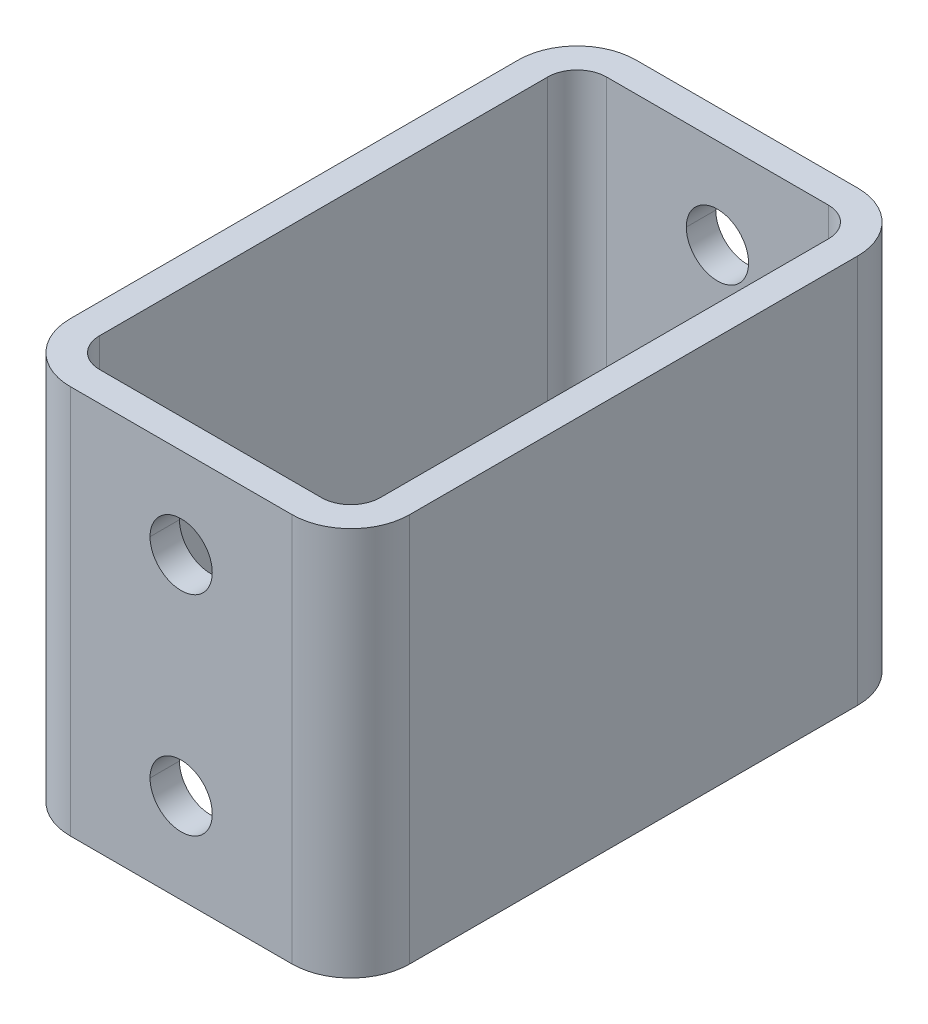
ISO-10303-21;
HEADER;
FILE_DESCRIPTION(('STEP AP214'),'2;1');
FILE_NAME('part.step','',(''),(''),'','','');
FILE_SCHEMA(('AUTOMOTIVE_DESIGN { 1 0 10303 214 1 1 1 1 }'));
ENDSEC;
DATA;
#1=APPLICATION_CONTEXT('core data for automotive mechanical design processes');
#2=APPLICATION_PROTOCOL_DEFINITION('international standard','automotive_design',2000,#1);
#3=PRODUCT_CONTEXT('',#1,'mechanical');
#4=PRODUCT('Part','Part','',(#3));
#5=PRODUCT_RELATED_PRODUCT_CATEGORY('part','',(#4));
#6=PRODUCT_DEFINITION_FORMATION('','',#4);
#7=PRODUCT_DEFINITION_CONTEXT('part definition',#1,'design');
#8=PRODUCT_DEFINITION('design','',#6,#7);
#9=PRODUCT_DEFINITION_SHAPE('','',#8);
#10=(LENGTH_UNIT() NAMED_UNIT(*) SI_UNIT(.MILLI.,.METRE.));
#11=(NAMED_UNIT(*) PLANE_ANGLE_UNIT() SI_UNIT($,.RADIAN.));
#12=(NAMED_UNIT(*) SI_UNIT($,.STERADIAN.) SOLID_ANGLE_UNIT());
#13=UNCERTAINTY_MEASURE_WITH_UNIT(LENGTH_MEASURE(1.E-05),#10,'distance_accuracy_value','');
#14=(GEOMETRIC_REPRESENTATION_CONTEXT(3) GLOBAL_UNCERTAINTY_ASSIGNED_CONTEXT((#13)) GLOBAL_UNIT_ASSIGNED_CONTEXT((#10,
#11,#12)) REPRESENTATION_CONTEXT('',''));
#15=CARTESIAN_POINT('',(0.,0.,0.));
#16=DIRECTION('',(0.,0.,1.));
#17=DIRECTION('',(1.,0.,0.));
#18=AXIS2_PLACEMENT_3D('',#15,#16,#17);
#19=CARTESIAN_POINT('',(0.,26.435,25.));
#20=DIRECTION('',(0.,0.,1.));
#21=DIRECTION('',(1.,0.,0.));
#22=AXIS2_PLACEMENT_3D('',#19,#20,#21);
#23=CYLINDRICAL_SURFACE('',#22,2.75);
#24=CARTESIAN_POINT('',(0.,26.435,-25.));
#25=DIRECTION('',(0.,0.,1.));
#26=DIRECTION('',(1.,0.,0.));
#27=AXIS2_PLACEMENT_3D('',#24,#25,#26);
#28=CIRCLE('',#27,2.75);
#29=CARTESIAN_POINT('',(-2.75,26.435,-25.));
#30=VERTEX_POINT('',#29);
#31=CARTESIAN_POINT('',(2.75,26.435,-25.));
#32=VERTEX_POINT('',#31);
#33=EDGE_CURVE('E41',#30,#32,#28,.T.);
#34=ORIENTED_EDGE('',*,*,#33,.F.);
#35=DIRECTION('',(0.,0.,1.));
#36=VECTOR('',#35,1.);
#37=CARTESIAN_POINT('',(-2.75,26.435,25.));
#38=LINE('',#37,#36);
#39=CARTESIAN_POINT('',(-2.75,26.435,-22.4));
#40=VERTEX_POINT('',#39);
#41=EDGE_CURVE('E11',#30,#40,#38,.T.);
#42=ORIENTED_EDGE('',*,*,#41,.T.);
#43=CARTESIAN_POINT('',(0.,26.435,-22.4));
#44=DIRECTION('',(0.,0.,1.));
#45=DIRECTION('',(1.,0.,0.));
#46=AXIS2_PLACEMENT_3D('',#43,#44,#45);
#47=CIRCLE('',#46,2.75);
#48=CARTESIAN_POINT('',(2.75,26.435,-22.4));
#49=VERTEX_POINT('',#48);
#50=EDGE_CURVE('E27',#40,#49,#47,.T.);
#51=ORIENTED_EDGE('',*,*,#50,.T.);
#52=DIRECTION('',(0.,0.,1.));
#53=VECTOR('',#52,1.);
#54=CARTESIAN_POINT('',(2.75,26.435,25.));
#55=LINE('',#54,#53);
#56=EDGE_CURVE('E114',#32,#49,#55,.T.);
#57=ORIENTED_EDGE('',*,*,#56,.F.);
#58=EDGE_LOOP('',(#34,#42,#51,#57));
#59=FACE_BOUND('',#58,.T.);
#60=ADVANCED_FACE('F16',(#59),#23,.F.);
#61=CARTESIAN_POINT('',(0.,26.435,25.));
#62=DIRECTION('',(0.,0.,1.));
#63=DIRECTION('',(1.,0.,0.));
#64=AXIS2_PLACEMENT_3D('',#61,#62,#63);
#65=CYLINDRICAL_SURFACE('',#64,2.75);
#66=CARTESIAN_POINT('',(0.,26.435,22.4));
#67=DIRECTION('',(0.,0.,-1.));
#68=DIRECTION('',(-1.,0.,0.));
#69=AXIS2_PLACEMENT_3D('',#66,#67,#68);
#70=CIRCLE('',#69,2.75);
#71=CARTESIAN_POINT('',(2.75,26.435,22.4));
#72=VERTEX_POINT('',#71);
#73=CARTESIAN_POINT('',(-2.75,26.435,22.4));
#74=VERTEX_POINT('',#73);
#75=EDGE_CURVE('E253',#72,#74,#70,.T.);
#76=ORIENTED_EDGE('',*,*,#75,.T.);
#77=DIRECTION('',(0.,0.,1.));
#78=VECTOR('',#77,1.);
#79=CARTESIAN_POINT('',(-2.75,26.435,25.));
#80=LINE('',#79,#78);
#81=CARTESIAN_POINT('',(-2.75,26.435,25.));
#82=VERTEX_POINT('',#81);
#83=EDGE_CURVE('E268',#74,#82,#80,.T.);
#84=ORIENTED_EDGE('',*,*,#83,.T.);
#85=CARTESIAN_POINT('',(0.,26.435,25.));
#86=DIRECTION('',(0.,0.,1.));
#87=DIRECTION('',(1.,0.,0.));
#88=AXIS2_PLACEMENT_3D('',#85,#86,#87);
#89=CIRCLE('',#88,2.75);
#90=CARTESIAN_POINT('',(2.75,26.435,25.));
#91=VERTEX_POINT('',#90);
#92=EDGE_CURVE('E255',#82,#91,#89,.T.);
#93=ORIENTED_EDGE('',*,*,#92,.T.);
#94=DIRECTION('',(0.,0.,1.));
#95=VECTOR('',#94,1.);
#96=CARTESIAN_POINT('',(2.75,26.435,25.));
#97=LINE('',#96,#95);
#98=EDGE_CURVE('E249',#72,#91,#97,.T.);
#99=ORIENTED_EDGE('',*,*,#98,.F.);
#100=EDGE_LOOP('',(#76,#84,#93,#99));
#101=FACE_BOUND('',#100,.T.);
#102=ADVANCED_FACE('F251',(#101),#65,.F.);
#103=CARTESIAN_POINT('',(0.,7.965,25.));
#104=DIRECTION('',(0.,0.,1.));
#105=DIRECTION('',(1.,0.,0.));
#106=AXIS2_PLACEMENT_3D('',#103,#104,#105);
#107=CYLINDRICAL_SURFACE('',#106,2.75);
#108=CARTESIAN_POINT('',(0.,7.965,-25.));
#109=DIRECTION('',(0.,0.,1.));
#110=DIRECTION('',(1.,0.,0.));
#111=AXIS2_PLACEMENT_3D('',#108,#109,#110);
#112=CIRCLE('',#111,2.75);
#113=CARTESIAN_POINT('',(-2.75,7.965,-25.));
#114=VERTEX_POINT('',#113);
#115=CARTESIAN_POINT('',(2.75,7.965,-25.));
#116=VERTEX_POINT('',#115);
#117=EDGE_CURVE('E286',#114,#116,#112,.T.);
#118=ORIENTED_EDGE('',*,*,#117,.F.);
#119=DIRECTION('',(0.,0.,1.));
#120=VECTOR('',#119,1.);
#121=CARTESIAN_POINT('',(-2.75,7.965,25.));
#122=LINE('',#121,#120);
#123=CARTESIAN_POINT('',(-2.75,7.965,-22.4));
#124=VERTEX_POINT('',#123);
#125=EDGE_CURVE('E378',#114,#124,#122,.T.);
#126=ORIENTED_EDGE('',*,*,#125,.T.);
#127=CARTESIAN_POINT('',(0.,7.965,-22.4));
#128=DIRECTION('',(0.,0.,1.));
#129=DIRECTION('',(1.,0.,0.));
#130=AXIS2_PLACEMENT_3D('',#127,#128,#129);
#131=CIRCLE('',#130,2.75);
#132=CARTESIAN_POINT('',(2.75,7.965,-22.4));
#133=VERTEX_POINT('',#132);
#134=EDGE_CURVE('E374',#124,#133,#131,.T.);
#135=ORIENTED_EDGE('',*,*,#134,.T.);
#136=DIRECTION('',(0.,0.,1.));
#137=VECTOR('',#136,1.);
#138=CARTESIAN_POINT('',(2.75,7.965,25.));
#139=LINE('',#138,#137);
#140=EDGE_CURVE('E278',#116,#133,#139,.T.);
#141=ORIENTED_EDGE('',*,*,#140,.F.);
#142=EDGE_LOOP('',(#118,#126,#135,#141));
#143=FACE_BOUND('',#142,.T.);
#144=ADVANCED_FACE('F703',(#143),#107,.F.);
#145=CARTESIAN_POINT('',(0.,7.965,25.));
#146=DIRECTION('',(0.,0.,1.));
#147=DIRECTION('',(1.,0.,0.));
#148=AXIS2_PLACEMENT_3D('',#145,#146,#147);
#149=CYLINDRICAL_SURFACE('',#148,2.75);
#150=CARTESIAN_POINT('',(0.,7.965,22.4));
#151=DIRECTION('',(0.,0.,-1.));
#152=DIRECTION('',(-1.,0.,0.));
#153=AXIS2_PLACEMENT_3D('',#150,#151,#152);
#154=CIRCLE('',#153,2.75);
#155=CARTESIAN_POINT('',(2.75,7.965,22.4));
#156=VERTEX_POINT('',#155);
#157=CARTESIAN_POINT('',(-2.75,7.965,22.4));
#158=VERTEX_POINT('',#157);
#159=EDGE_CURVE('E334',#156,#158,#154,.T.);
#160=ORIENTED_EDGE('',*,*,#159,.T.);
#161=DIRECTION('',(0.,0.,1.));
#162=VECTOR('',#161,1.);
#163=CARTESIAN_POINT('',(-2.75,7.965,25.));
#164=LINE('',#163,#162);
#165=CARTESIAN_POINT('',(-2.75,7.965,25.));
#166=VERTEX_POINT('',#165);
#167=EDGE_CURVE('E296',#158,#166,#164,.T.);
#168=ORIENTED_EDGE('',*,*,#167,.T.);
#169=CARTESIAN_POINT('',(0.,7.965,25.));
#170=DIRECTION('',(0.,0.,1.));
#171=DIRECTION('',(1.,0.,0.));
#172=AXIS2_PLACEMENT_3D('',#169,#170,#171);
#173=CIRCLE('',#172,2.75);
#174=CARTESIAN_POINT('',(2.75,7.965,25.));
#175=VERTEX_POINT('',#174);
#176=EDGE_CURVE('E292',#166,#175,#173,.T.);
#177=ORIENTED_EDGE('',*,*,#176,.T.);
#178=DIRECTION('',(0.,0.,1.));
#179=VECTOR('',#178,1.);
#180=CARTESIAN_POINT('',(2.75,7.965,25.));
#181=LINE('',#180,#179);
#182=EDGE_CURVE('E437',#156,#175,#181,.T.);
#183=ORIENTED_EDGE('',*,*,#182,.F.);
#184=EDGE_LOOP('',(#160,#168,#177,#183));
#185=FACE_BOUND('',#184,.T.);
#186=ADVANCED_FACE('F708',(#185),#149,.F.);
#187=CARTESIAN_POINT('',(9.8,34.4,-19.8));
#188=DIRECTION('',(0.,-1.,0.));
#189=DIRECTION('',(0.,0.,-1.));
#190=AXIS2_PLACEMENT_3D('',#187,#188,#189);
#191=CYLINDRICAL_SURFACE('',#190,5.2);
#192=CARTESIAN_POINT('',(9.8,0.,-19.8));
#193=DIRECTION('',(0.,1.,0.));
#194=DIRECTION('',(0.,0.,1.));
#195=AXIS2_PLACEMENT_3D('',#192,#193,#194);
#196=CIRCLE('',#195,5.2);
#197=CARTESIAN_POINT('',(15.,0.,-19.8));
#198=VERTEX_POINT('',#197);
#199=CARTESIAN_POINT('',(9.8,0.,-25.));
#200=VERTEX_POINT('',#199);
#201=EDGE_CURVE('E297',#198,#200,#196,.T.);
#202=ORIENTED_EDGE('',*,*,#201,.T.);
#203=DIRECTION('',(0.,-1.,0.));
#204=VECTOR('',#203,1.);
#205=CARTESIAN_POINT('',(9.8,34.4,-25.));
#206=LINE('',#205,#204);
#207=CARTESIAN_POINT('',(9.8,34.4,-25.));
#208=VERTEX_POINT('',#207);
#209=EDGE_CURVE('E370',#208,#200,#206,.T.);
#210=ORIENTED_EDGE('',*,*,#209,.F.);
#211=CARTESIAN_POINT('',(9.8,34.4,-19.8));
#212=DIRECTION('',(0.,1.,0.));
#213=DIRECTION('',(0.,0.,1.));
#214=AXIS2_PLACEMENT_3D('',#211,#212,#213);
#215=CIRCLE('',#214,5.2);
#216=CARTESIAN_POINT('',(15.,34.4,-19.8));
#217=VERTEX_POINT('',#216);
#218=EDGE_CURVE('E314',#217,#208,#215,.T.);
#219=ORIENTED_EDGE('',*,*,#218,.F.);
#220=DIRECTION('',(0.,-1.,0.));
#221=VECTOR('',#220,1.);
#222=CARTESIAN_POINT('',(15.,34.4,-19.8));
#223=LINE('',#222,#221);
#224=EDGE_CURVE('E346',#217,#198,#223,.T.);
#225=ORIENTED_EDGE('',*,*,#224,.T.);
#226=EDGE_LOOP('',(#202,#210,#219,#225));
#227=FACE_BOUND('',#226,.T.);
#228=ADVANCED_FACE('F782',(#227),#191,.T.);
#229=CARTESIAN_POINT('',(9.8,34.4,-25.));
#230=DIRECTION('',(0.,0.,1.));
#231=DIRECTION('',(1.,0.,0.));
#232=AXIS2_PLACEMENT_3D('',#229,#230,#231);
#233=PLANE('',#232);
#234=DIRECTION('',(-1.,0.,0.));
#235=VECTOR('',#234,1.);
#236=CARTESIAN_POINT('',(9.8,0.,-25.));
#237=LINE('',#236,#235);
#238=CARTESIAN_POINT('',(-9.8,0.,-25.));
#239=VERTEX_POINT('',#238);
#240=EDGE_CURVE('E408',#200,#239,#237,.T.);
#241=ORIENTED_EDGE('',*,*,#240,.T.);
#242=DIRECTION('',(0.,-1.,0.));
#243=VECTOR('',#242,1.);
#244=CARTESIAN_POINT('',(-9.8,34.4,-25.));
#245=LINE('',#244,#243);
#246=CARTESIAN_POINT('',(-9.8,34.4,-25.));
#247=VERTEX_POINT('',#246);
#248=EDGE_CURVE('E396',#247,#239,#245,.T.);
#249=ORIENTED_EDGE('',*,*,#248,.F.);
#250=DIRECTION('',(-1.,0.,0.));
#251=VECTOR('',#250,1.);
#252=CARTESIAN_POINT('',(9.8,34.4,-25.));
#253=LINE('',#252,#251);
#254=EDGE_CURVE('E443',#208,#247,#253,.T.);
#255=ORIENTED_EDGE('',*,*,#254,.F.);
#256=ORIENTED_EDGE('',*,*,#209,.T.);
#257=EDGE_LOOP('',(#241,#249,#255,#256));
#258=FACE_BOUND('',#257,.T.);
#259=CARTESIAN_POINT('',(0.,26.435,-25.));
#260=DIRECTION('',(0.,0.,1.));
#261=DIRECTION('',(1.,0.,0.));
#262=AXIS2_PLACEMENT_3D('',#259,#260,#261);
#263=CIRCLE('',#262,2.75);
#264=EDGE_CURVE('E366',#32,#30,#263,.T.);
#265=ORIENTED_EDGE('',*,*,#264,.T.);
#266=ORIENTED_EDGE('',*,*,#33,.T.);
#267=EDGE_LOOP('',(#265,#266));
#268=FACE_BOUND('',#267,.T.);
#269=CARTESIAN_POINT('',(0.,7.965,-25.));
#270=DIRECTION('',(0.,0.,1.));
#271=DIRECTION('',(1.,0.,0.));
#272=AXIS2_PLACEMENT_3D('',#269,#270,#271);
#273=CIRCLE('',#272,2.75);
#274=EDGE_CURVE('E282',#116,#114,#273,.T.);
#275=ORIENTED_EDGE('',*,*,#274,.T.);
#276=ORIENTED_EDGE('',*,*,#117,.T.);
#277=EDGE_LOOP('',(#275,#276));
#278=FACE_BOUND('',#277,.T.);
#279=ADVANCED_FACE('F838',(#258,#268,#278),#233,.F.);
#280=CARTESIAN_POINT('',(-9.8,34.4,-19.8));
#281=DIRECTION('',(0.,-1.,0.));
#282=DIRECTION('',(0.,0.,-1.));
#283=AXIS2_PLACEMENT_3D('',#280,#281,#282);
#284=CYLINDRICAL_SURFACE('',#283,5.2);
#285=CARTESIAN_POINT('',(-9.8,0.,-19.8));
#286=DIRECTION('',(0.,1.,0.));
#287=DIRECTION('',(0.,0.,1.));
#288=AXIS2_PLACEMENT_3D('',#285,#286,#287);
#289=CIRCLE('',#288,5.2);
#290=CARTESIAN_POINT('',(-15.,0.,-19.8));
#291=VERTEX_POINT('',#290);
#292=EDGE_CURVE('E342',#239,#291,#289,.T.);
#293=ORIENTED_EDGE('',*,*,#292,.T.);
#294=DIRECTION('',(0.,-1.,0.));
#295=VECTOR('',#294,1.);
#296=CARTESIAN_POINT('',(-15.,34.4,-19.8));
#297=LINE('',#296,#295);
#298=CARTESIAN_POINT('',(-15.,34.4,-19.8));
#299=VERTEX_POINT('',#298);
#300=EDGE_CURVE('E361',#299,#291,#297,.T.);
#301=ORIENTED_EDGE('',*,*,#300,.F.);
#302=CARTESIAN_POINT('',(-9.8,34.4,-19.8));
#303=DIRECTION('',(0.,1.,0.));
#304=DIRECTION('',(0.,0.,1.));
#305=AXIS2_PLACEMENT_3D('',#302,#303,#304);
#306=CIRCLE('',#305,5.2);
#307=EDGE_CURVE('E308',#247,#299,#306,.T.);
#308=ORIENTED_EDGE('',*,*,#307,.F.);
#309=ORIENTED_EDGE('',*,*,#248,.T.);
#310=EDGE_LOOP('',(#293,#301,#308,#309));
#311=FACE_BOUND('',#310,.T.);
#312=ADVANCED_FACE('F804',(#311),#284,.T.);
#313=CARTESIAN_POINT('',(-15.,34.4,19.8));
#314=DIRECTION('',(1.,0.,0.));
#315=DIRECTION('',(0.,1.,0.));
#316=AXIS2_PLACEMENT_3D('',#313,#314,#315);
#317=PLANE('',#316);
#318=DIRECTION('',(0.,0.,1.));
#319=VECTOR('',#318,1.);
#320=CARTESIAN_POINT('',(-15.,0.,19.8));
#321=LINE('',#320,#319);
#322=CARTESIAN_POINT('',(-15.,0.,19.8));
#323=VERTEX_POINT('',#322);
#324=EDGE_CURVE('E364',#291,#323,#321,.T.);
#325=ORIENTED_EDGE('',*,*,#324,.T.);
#326=DIRECTION('',(0.,-1.,0.));
#327=VECTOR('',#326,1.);
#328=CARTESIAN_POINT('',(-15.,34.4,19.8));
#329=LINE('',#328,#327);
#330=CARTESIAN_POINT('',(-15.,34.4,19.8));
#331=VERTEX_POINT('',#330);
#332=EDGE_CURVE('E20',#331,#323,#329,.T.);
#333=ORIENTED_EDGE('',*,*,#332,.F.);
#334=DIRECTION('',(0.,0.,1.));
#335=VECTOR('',#334,1.);
#336=CARTESIAN_POINT('',(-15.,34.4,19.8));
#337=LINE('',#336,#335);
#338=EDGE_CURVE('E305',#299,#331,#337,.T.);
#339=ORIENTED_EDGE('',*,*,#338,.F.);
#340=ORIENTED_EDGE('',*,*,#300,.T.);
#341=EDGE_LOOP('',(#325,#333,#339,#340));
#342=FACE_BOUND('',#341,.T.);
#343=ADVANCED_FACE('F799',(#342),#317,.F.);
#344=CARTESIAN_POINT('',(-9.8,34.4,19.8));
#345=DIRECTION('',(0.,-1.,0.));
#346=DIRECTION('',(0.,0.,-1.));
#347=AXIS2_PLACEMENT_3D('',#344,#345,#346);
#348=CYLINDRICAL_SURFACE('',#347,5.2);
#349=CARTESIAN_POINT('',(-9.8,0.,19.8));
#350=DIRECTION('',(0.,1.,0.));
#351=DIRECTION('',(0.,0.,1.));
#352=AXIS2_PLACEMENT_3D('',#349,#350,#351);
#353=CIRCLE('',#352,5.2);
#354=CARTESIAN_POINT('',(-9.8,0.,25.));
#355=VERTEX_POINT('',#354);
#356=EDGE_CURVE('E365',#323,#355,#353,.T.);
#357=ORIENTED_EDGE('',*,*,#356,.T.);
#358=DIRECTION('',(0.,-1.,0.));
#359=VECTOR('',#358,1.);
#360=CARTESIAN_POINT('',(-9.8,34.4,25.));
#361=LINE('',#360,#359);
#362=CARTESIAN_POINT('',(-9.8,34.4,25.));
#363=VERTEX_POINT('',#362);
#364=EDGE_CURVE('E389',#363,#355,#361,.T.);
#365=ORIENTED_EDGE('',*,*,#364,.F.);
#366=CARTESIAN_POINT('',(-9.8,34.4,19.8));
#367=DIRECTION('',(0.,1.,0.));
#368=DIRECTION('',(0.,0.,1.));
#369=AXIS2_PLACEMENT_3D('',#366,#367,#368);
#370=CIRCLE('',#369,5.2);
#371=EDGE_CURVE('E309',#331,#363,#370,.T.);
#372=ORIENTED_EDGE('',*,*,#371,.F.);
#373=ORIENTED_EDGE('',*,*,#332,.T.);
#374=EDGE_LOOP('',(#357,#365,#372,#373));
#375=FACE_BOUND('',#374,.T.);
#376=ADVANCED_FACE('F666',(#375),#348,.T.);
#377=CARTESIAN_POINT('',(-9.8,34.4,25.));
#378=DIRECTION('',(0.,0.,-1.));
#379=DIRECTION('',(0.,-1.,0.));
#380=AXIS2_PLACEMENT_3D('',#377,#378,#379);
#381=PLANE('',#380);
#382=DIRECTION('',(1.,0.,0.));
#383=VECTOR('',#382,1.);
#384=CARTESIAN_POINT('',(-9.8,0.,25.));
#385=LINE('',#384,#383);
#386=CARTESIAN_POINT('',(9.8,0.,25.));
#387=VERTEX_POINT('',#386);
#388=EDGE_CURVE('E385',#355,#387,#385,.T.);
#389=ORIENTED_EDGE('',*,*,#388,.T.);
#390=DIRECTION('',(0.,-1.,0.));
#391=VECTOR('',#390,1.);
#392=CARTESIAN_POINT('',(9.8,34.4,25.));
#393=LINE('',#392,#391);
#394=CARTESIAN_POINT('',(9.8,34.4,25.));
#395=VERTEX_POINT('',#394);
#396=EDGE_CURVE('E351',#395,#387,#393,.T.);
#397=ORIENTED_EDGE('',*,*,#396,.F.);
#398=DIRECTION('',(1.,0.,0.));
#399=VECTOR('',#398,1.);
#400=CARTESIAN_POINT('',(-9.8,34.4,25.));
#401=LINE('',#400,#399);
#402=EDGE_CURVE('E448',#363,#395,#401,.T.);
#403=ORIENTED_EDGE('',*,*,#402,.F.);
#404=ORIENTED_EDGE('',*,*,#364,.T.);
#405=EDGE_LOOP('',(#389,#397,#403,#404));
#406=FACE_BOUND('',#405,.T.);
#407=CARTESIAN_POINT('',(0.,26.435,25.));
#408=DIRECTION('',(0.,0.,1.));
#409=DIRECTION('',(1.,0.,0.));
#410=AXIS2_PLACEMENT_3D('',#407,#408,#409);
#411=CIRCLE('',#410,2.75);
#412=EDGE_CURVE('E262',#91,#82,#411,.T.);
#413=ORIENTED_EDGE('',*,*,#412,.F.);
#414=ORIENTED_EDGE('',*,*,#92,.F.);
#415=EDGE_LOOP('',(#413,#414));
#416=FACE_BOUND('',#415,.T.);
#417=CARTESIAN_POINT('',(0.,7.965,25.));
#418=DIRECTION('',(0.,0.,1.));
#419=DIRECTION('',(1.,0.,0.));
#420=AXIS2_PLACEMENT_3D('',#417,#418,#419);
#421=CIRCLE('',#420,2.75);
#422=EDGE_CURVE('E291',#175,#166,#421,.T.);
#423=ORIENTED_EDGE('',*,*,#422,.F.);
#424=ORIENTED_EDGE('',*,*,#176,.F.);
#425=EDGE_LOOP('',(#423,#424));
#426=FACE_BOUND('',#425,.T.);
#427=ADVANCED_FACE('F660',(#406,#416,#426),#381,.F.);
#428=CARTESIAN_POINT('',(9.8,34.4,19.8));
#429=DIRECTION('',(0.,-1.,0.));
#430=DIRECTION('',(0.,0.,-1.));
#431=AXIS2_PLACEMENT_3D('',#428,#429,#430);
#432=CYLINDRICAL_SURFACE('',#431,5.2);
#433=CARTESIAN_POINT('',(9.8,0.,19.8));
#434=DIRECTION('',(0.,1.,0.));
#435=DIRECTION('',(0.,0.,1.));
#436=AXIS2_PLACEMENT_3D('',#433,#434,#435);
#437=CIRCLE('',#436,5.2);
#438=CARTESIAN_POINT('',(15.,0.,19.8));
#439=VERTEX_POINT('',#438);
#440=EDGE_CURVE('E430',#387,#439,#437,.T.);
#441=ORIENTED_EDGE('',*,*,#440,.T.);
#442=DIRECTION('',(0.,-1.,0.));
#443=VECTOR('',#442,1.);
#444=CARTESIAN_POINT('',(15.,34.4,19.8));
#445=LINE('',#444,#443);
#446=CARTESIAN_POINT('',(15.,34.4,19.8));
#447=VERTEX_POINT('',#446);
#448=EDGE_CURVE('E310',#447,#439,#445,.T.);
#449=ORIENTED_EDGE('',*,*,#448,.F.);
#450=CARTESIAN_POINT('',(9.8,34.4,19.8));
#451=DIRECTION('',(0.,1.,0.));
#452=DIRECTION('',(0.,0.,1.));
#453=AXIS2_PLACEMENT_3D('',#450,#451,#452);
#454=CIRCLE('',#453,5.2);
#455=EDGE_CURVE('E429',#395,#447,#454,.T.);
#456=ORIENTED_EDGE('',*,*,#455,.F.);
#457=ORIENTED_EDGE('',*,*,#396,.T.);
#458=EDGE_LOOP('',(#441,#449,#456,#457));
#459=FACE_BOUND('',#458,.T.);
#460=ADVANCED_FACE('F665',(#459),#432,.T.);
#461=CARTESIAN_POINT('',(-9.8,34.4,-19.8));
#462=DIRECTION('',(0.,-1.,0.));
#463=DIRECTION('',(0.,0.,-1.));
#464=AXIS2_PLACEMENT_3D('',#461,#462,#463);
#465=CYLINDRICAL_SURFACE('',#464,2.6);
#466=CARTESIAN_POINT('',(-9.8,0.,-19.8));
#467=DIRECTION('',(0.,1.,0.));
#468=DIRECTION('',(0.,0.,1.));
#469=AXIS2_PLACEMENT_3D('',#466,#467,#468);
#470=CIRCLE('',#469,2.6);
#471=CARTESIAN_POINT('',(-9.8,0.,-22.4));
#472=VERTEX_POINT('',#471);
#473=CARTESIAN_POINT('',(-12.4,0.,-19.8));
#474=VERTEX_POINT('',#473);
#475=EDGE_CURVE('E415',#472,#474,#470,.T.);
#476=ORIENTED_EDGE('',*,*,#475,.F.);
#477=DIRECTION('',(0.,-1.,0.));
#478=VECTOR('',#477,1.);
#479=CARTESIAN_POINT('',(-9.8,34.4,-22.4));
#480=LINE('',#479,#478);
#481=CARTESIAN_POINT('',(-9.8,34.4,-22.4));
#482=VERTEX_POINT('',#481);
#483=EDGE_CURVE('E315',#482,#472,#480,.T.);
#484=ORIENTED_EDGE('',*,*,#483,.F.);
#485=CARTESIAN_POINT('',(-9.8,34.4,-19.8));
#486=DIRECTION('',(0.,1.,0.));
#487=DIRECTION('',(0.,0.,1.));
#488=AXIS2_PLACEMENT_3D('',#485,#486,#487);
#489=CIRCLE('',#488,2.6);
#490=CARTESIAN_POINT('',(-12.4,34.4,-19.8));
#491=VERTEX_POINT('',#490);
#492=EDGE_CURVE('E347',#482,#491,#489,.T.);
#493=ORIENTED_EDGE('',*,*,#492,.T.);
#494=DIRECTION('',(0.,-1.,0.));
#495=VECTOR('',#494,1.);
#496=CARTESIAN_POINT('',(-12.4,34.4,-19.8));
#497=LINE('',#496,#495);
#498=EDGE_CURVE('E352',#491,#474,#497,.T.);
#499=ORIENTED_EDGE('',*,*,#498,.T.);
#500=EDGE_LOOP('',(#476,#484,#493,#499));
#501=FACE_BOUND('',#500,.T.);
#502=ADVANCED_FACE('F717',(#501),#465,.F.);
#503=CARTESIAN_POINT('',(9.8,34.4,-22.4));
#504=DIRECTION('',(0.,0.,1.));
#505=DIRECTION('',(1.,0.,0.));
#506=AXIS2_PLACEMENT_3D('',#503,#504,#505);
#507=PLANE('',#506);
#508=DIRECTION('',(-1.,0.,0.));
#509=VECTOR('',#508,1.);
#510=CARTESIAN_POINT('',(9.8,0.,-22.4));
#511=LINE('',#510,#509);
#512=CARTESIAN_POINT('',(9.8,0.,-22.4));
#513=VERTEX_POINT('',#512);
#514=EDGE_CURVE('E356',#513,#472,#511,.T.);
#515=ORIENTED_EDGE('',*,*,#514,.F.);
#516=DIRECTION('',(0.,-1.,0.));
#517=VECTOR('',#516,1.);
#518=CARTESIAN_POINT('',(9.8,34.4,-22.4));
#519=LINE('',#518,#517);
#520=CARTESIAN_POINT('',(9.8,34.4,-22.4));
#521=VERTEX_POINT('',#520);
#522=EDGE_CURVE('E383',#521,#513,#519,.T.);
#523=ORIENTED_EDGE('',*,*,#522,.F.);
#524=DIRECTION('',(-1.,0.,0.));
#525=VECTOR('',#524,1.);
#526=CARTESIAN_POINT('',(9.8,34.4,-22.4));
#527=LINE('',#526,#525);
#528=EDGE_CURVE('E319',#521,#482,#527,.T.);
#529=ORIENTED_EDGE('',*,*,#528,.T.);
#530=ORIENTED_EDGE('',*,*,#483,.T.);
#531=EDGE_LOOP('',(#515,#523,#529,#530));
#532=FACE_BOUND('',#531,.T.);
#533=CARTESIAN_POINT('',(0.,26.435,-22.4));
#534=DIRECTION('',(0.,0.,1.));
#535=DIRECTION('',(1.,0.,0.));
#536=AXIS2_PLACEMENT_3D('',#533,#534,#535);
#537=CIRCLE('',#536,2.75);
#538=EDGE_CURVE('E411',#49,#40,#537,.T.);
#539=ORIENTED_EDGE('',*,*,#538,.F.);
#540=ORIENTED_EDGE('',*,*,#50,.F.);
#541=EDGE_LOOP('',(#539,#540));
#542=FACE_BOUND('',#541,.T.);
#543=CARTESIAN_POINT('',(0.,7.965,-22.4));
#544=DIRECTION('',(0.,0.,1.));
#545=DIRECTION('',(1.,0.,0.));
#546=AXIS2_PLACEMENT_3D('',#543,#544,#545);
#547=CIRCLE('',#546,2.75);
#548=EDGE_CURVE('E271',#133,#124,#547,.T.);
#549=ORIENTED_EDGE('',*,*,#548,.F.);
#550=ORIENTED_EDGE('',*,*,#134,.F.);
#551=EDGE_LOOP('',(#549,#550));
#552=FACE_BOUND('',#551,.T.);
#553=ADVANCED_FACE('F529',(#532,#542,#552),#507,.T.);
#554=CARTESIAN_POINT('',(9.8,34.4,-19.8));
#555=DIRECTION('',(0.,-1.,0.));
#556=DIRECTION('',(0.,0.,-1.));
#557=AXIS2_PLACEMENT_3D('',#554,#555,#556);
#558=CYLINDRICAL_SURFACE('',#557,2.6);
#559=CARTESIAN_POINT('',(9.8,0.,-19.8));
#560=DIRECTION('',(0.,1.,0.));
#561=DIRECTION('',(0.,0.,1.));
#562=AXIS2_PLACEMENT_3D('',#559,#560,#561);
#563=CIRCLE('',#562,2.6);
#564=CARTESIAN_POINT('',(12.4,0.,-19.8));
#565=VERTEX_POINT('',#564);
#566=EDGE_CURVE('E302',#565,#513,#563,.T.);
#567=ORIENTED_EDGE('',*,*,#566,.F.);
#568=DIRECTION('',(0.,-1.,0.));
#569=VECTOR('',#568,1.);
#570=CARTESIAN_POINT('',(12.4,34.4,-19.8));
#571=LINE('',#570,#569);
#572=CARTESIAN_POINT('',(12.4,34.4,-19.8));
#573=VERTEX_POINT('',#572);
#574=EDGE_CURVE('E384',#573,#565,#571,.T.);
#575=ORIENTED_EDGE('',*,*,#574,.F.);
#576=CARTESIAN_POINT('',(9.8,34.4,-19.8));
#577=DIRECTION('',(0.,1.,0.));
#578=DIRECTION('',(0.,0.,1.));
#579=AXIS2_PLACEMENT_3D('',#576,#577,#578);
#580=CIRCLE('',#579,2.6);
#581=EDGE_CURVE('E320',#573,#521,#580,.T.);
#582=ORIENTED_EDGE('',*,*,#581,.T.);
#583=ORIENTED_EDGE('',*,*,#522,.T.);
#584=EDGE_LOOP('',(#567,#575,#582,#583));
#585=FACE_BOUND('',#584,.T.);
#586=ADVANCED_FACE('F525',(#585),#558,.F.);
#587=CARTESIAN_POINT('',(12.4,34.4,-19.8));
#588=DIRECTION('',(-1.,0.,0.));
#589=DIRECTION('',(0.,0.,1.));
#590=AXIS2_PLACEMENT_3D('',#587,#588,#589);
#591=PLANE('',#590);
#592=DIRECTION('',(0.,0.,-1.));
#593=VECTOR('',#592,1.);
#594=CARTESIAN_POINT('',(12.4,0.,-19.8));
#595=LINE('',#594,#593);
#596=CARTESIAN_POINT('',(12.4,0.,19.8));
#597=VERTEX_POINT('',#596);
#598=EDGE_CURVE('E298',#597,#565,#595,.T.);
#599=ORIENTED_EDGE('',*,*,#598,.F.);
#600=DIRECTION('',(0.,-1.,0.));
#601=VECTOR('',#600,1.);
#602=CARTESIAN_POINT('',(12.4,34.4,19.8));
#603=LINE('',#602,#601);
#604=CARTESIAN_POINT('',(12.4,34.4,19.8));
#605=VERTEX_POINT('',#604);
#606=EDGE_CURVE('E419',#605,#597,#603,.T.);
#607=ORIENTED_EDGE('',*,*,#606,.F.);
#608=DIRECTION('',(0.,0.,-1.));
#609=VECTOR('',#608,1.);
#610=CARTESIAN_POINT('',(12.4,34.4,-19.8));
#611=LINE('',#610,#609);
#612=EDGE_CURVE('E379',#605,#573,#611,.T.);
#613=ORIENTED_EDGE('',*,*,#612,.T.);
#614=ORIENTED_EDGE('',*,*,#574,.T.);
#615=EDGE_LOOP('',(#599,#607,#613,#614));
#616=FACE_BOUND('',#615,.T.);
#617=ADVANCED_FACE('F494',(#616),#591,.T.);
#618=CARTESIAN_POINT('',(9.8,34.4,19.8));
#619=DIRECTION('',(0.,-1.,0.));
#620=DIRECTION('',(0.,0.,-1.));
#621=AXIS2_PLACEMENT_3D('',#618,#619,#620);
#622=CYLINDRICAL_SURFACE('',#621,2.6);
#623=CARTESIAN_POINT('',(9.8,0.,19.8));
#624=DIRECTION('',(0.,1.,0.));
#625=DIRECTION('',(0.,0.,1.));
#626=AXIS2_PLACEMENT_3D('',#623,#624,#625);
#627=CIRCLE('',#626,2.6);
#628=CARTESIAN_POINT('',(9.8,0.,22.4));
#629=VERTEX_POINT('',#628);
#630=EDGE_CURVE('E185',#629,#597,#627,.T.);
#631=ORIENTED_EDGE('',*,*,#630,.F.);
#632=DIRECTION('',(0.,-1.,0.));
#633=VECTOR('',#632,1.);
#634=CARTESIAN_POINT('',(9.8,34.4,22.4));
#635=LINE('',#634,#633);
#636=CARTESIAN_POINT('',(9.8,34.4,22.4));
#637=VERTEX_POINT('',#636);
#638=EDGE_CURVE('E195',#637,#629,#635,.T.);
#639=ORIENTED_EDGE('',*,*,#638,.F.);
#640=CARTESIAN_POINT('',(9.8,34.4,19.8));
#641=DIRECTION('',(0.,1.,0.));
#642=DIRECTION('',(0.,0.,1.));
#643=AXIS2_PLACEMENT_3D('',#640,#641,#642);
#644=CIRCLE('',#643,2.6);
#645=EDGE_CURVE('E422',#637,#605,#644,.T.);
#646=ORIENTED_EDGE('',*,*,#645,.T.);
#647=ORIENTED_EDGE('',*,*,#606,.T.);
#648=EDGE_LOOP('',(#631,#639,#646,#647));
#649=FACE_BOUND('',#648,.T.);
#650=ADVANCED_FACE('F742',(#649),#622,.F.);
#651=CARTESIAN_POINT('',(-9.8,34.4,22.4));
#652=DIRECTION('',(0.,0.,-1.));
#653=DIRECTION('',(0.,-1.,0.));
#654=AXIS2_PLACEMENT_3D('',#651,#652,#653);
#655=PLANE('',#654);
#656=DIRECTION('',(1.,0.,0.));
#657=VECTOR('',#656,1.);
#658=CARTESIAN_POINT('',(-9.8,0.,22.4));
#659=LINE('',#658,#657);
#660=CARTESIAN_POINT('',(-9.8,0.,22.4));
#661=VERTEX_POINT('',#660);
#662=EDGE_CURVE('E321',#661,#629,#659,.T.);
#663=ORIENTED_EDGE('',*,*,#662,.F.);
#664=DIRECTION('',(0.,-1.,0.));
#665=VECTOR('',#664,1.);
#666=CARTESIAN_POINT('',(-9.8,34.4,22.4));
#667=LINE('',#666,#665);
#668=CARTESIAN_POINT('',(-9.8,34.4,22.4));
#669=VERTEX_POINT('',#668);
#670=EDGE_CURVE('E397',#669,#661,#667,.T.);
#671=ORIENTED_EDGE('',*,*,#670,.F.);
#672=DIRECTION('',(1.,0.,0.));
#673=VECTOR('',#672,1.);
#674=CARTESIAN_POINT('',(-9.8,34.4,22.4));
#675=LINE('',#674,#673);
#676=EDGE_CURVE('E423',#669,#637,#675,.T.);
#677=ORIENTED_EDGE('',*,*,#676,.T.);
#678=ORIENTED_EDGE('',*,*,#638,.T.);
#679=EDGE_LOOP('',(#663,#671,#677,#678));
#680=FACE_BOUND('',#679,.T.);
#681=ORIENTED_EDGE('',*,*,#75,.F.);
#682=CARTESIAN_POINT('',(0.,26.435,22.4));
#683=DIRECTION('',(0.,0.,-1.));
#684=DIRECTION('',(-1.,0.,0.));
#685=AXIS2_PLACEMENT_3D('',#682,#683,#684);
#686=CIRCLE('',#685,2.75);
#687=EDGE_CURVE('E261',#74,#72,#686,.T.);
#688=ORIENTED_EDGE('',*,*,#687,.F.);
#689=EDGE_LOOP('',(#681,#688));
#690=FACE_BOUND('',#689,.T.);
#691=ORIENTED_EDGE('',*,*,#159,.F.);
#692=CARTESIAN_POINT('',(0.,7.965,22.4));
#693=DIRECTION('',(0.,0.,-1.));
#694=DIRECTION('',(-1.,0.,0.));
#695=AXIS2_PLACEMENT_3D('',#692,#693,#694);
#696=CIRCLE('',#695,2.75);
#697=EDGE_CURVE('E360',#158,#156,#696,.T.);
#698=ORIENTED_EDGE('',*,*,#697,.F.);
#699=EDGE_LOOP('',(#691,#698));
#700=FACE_BOUND('',#699,.T.);
#701=ADVANCED_FACE('F265',(#680,#690,#700),#655,.T.);
#702=CARTESIAN_POINT('',(-9.8,34.4,19.8));
#703=DIRECTION('',(0.,-1.,0.));
#704=DIRECTION('',(0.,0.,-1.));
#705=AXIS2_PLACEMENT_3D('',#702,#703,#704);
#706=CYLINDRICAL_SURFACE('',#705,2.6);
#707=CARTESIAN_POINT('',(-9.8,0.,19.8));
#708=DIRECTION('',(0.,1.,0.));
#709=DIRECTION('',(0.,0.,1.));
#710=AXIS2_PLACEMENT_3D('',#707,#708,#709);
#711=CIRCLE('',#710,2.6);
#712=CARTESIAN_POINT('',(-12.4,0.,19.8));
#713=VERTEX_POINT('',#712);
#714=EDGE_CURVE('E325',#713,#661,#711,.T.);
#715=ORIENTED_EDGE('',*,*,#714,.F.);
#716=DIRECTION('',(0.,-1.,0.));
#717=VECTOR('',#716,1.);
#718=CARTESIAN_POINT('',(-12.4,34.4,19.8));
#719=LINE('',#718,#717);
#720=CARTESIAN_POINT('',(-12.4,34.4,19.8));
#721=VERTEX_POINT('',#720);
#722=EDGE_CURVE('E326',#721,#713,#719,.T.);
#723=ORIENTED_EDGE('',*,*,#722,.F.);
#724=CARTESIAN_POINT('',(-9.8,34.4,19.8));
#725=DIRECTION('',(0.,1.,0.));
#726=DIRECTION('',(0.,0.,1.));
#727=AXIS2_PLACEMENT_3D('',#724,#725,#726);
#728=CIRCLE('',#727,2.6);
#729=EDGE_CURVE('E401',#721,#669,#728,.T.);
#730=ORIENTED_EDGE('',*,*,#729,.T.);
#731=ORIENTED_EDGE('',*,*,#670,.T.);
#732=EDGE_LOOP('',(#715,#723,#730,#731));
#733=FACE_BOUND('',#732,.T.);
#734=ADVANCED_FACE('F506',(#733),#706,.F.);
#735=CARTESIAN_POINT('',(-12.4,34.4,19.8));
#736=DIRECTION('',(1.,0.,0.));
#737=DIRECTION('',(0.,1.,0.));
#738=AXIS2_PLACEMENT_3D('',#735,#736,#737);
#739=PLANE('',#738);
#740=DIRECTION('',(0.,0.,1.));
#741=VECTOR('',#740,1.);
#742=CARTESIAN_POINT('',(-12.4,0.,19.8));
#743=LINE('',#742,#741);
#744=EDGE_CURVE('E338',#474,#713,#743,.T.);
#745=ORIENTED_EDGE('',*,*,#744,.F.);
#746=ORIENTED_EDGE('',*,*,#498,.F.);
#747=DIRECTION('',(0.,0.,1.));
#748=VECTOR('',#747,1.);
#749=CARTESIAN_POINT('',(-12.4,34.4,19.8));
#750=LINE('',#749,#748);
#751=EDGE_CURVE('E330',#491,#721,#750,.T.);
#752=ORIENTED_EDGE('',*,*,#751,.T.);
#753=ORIENTED_EDGE('',*,*,#722,.T.);
#754=EDGE_LOOP('',(#745,#746,#752,#753));
#755=FACE_BOUND('',#754,.T.);
#756=ADVANCED_FACE('F689',(#755),#739,.T.);
#757=CARTESIAN_POINT('',(15.,34.4,-19.8));
#758=DIRECTION('',(-1.,0.,0.));
#759=DIRECTION('',(0.,0.,1.));
#760=AXIS2_PLACEMENT_3D('',#757,#758,#759);
#761=PLANE('',#760);
#762=DIRECTION('',(0.,0.,-1.));
#763=VECTOR('',#762,1.);
#764=CARTESIAN_POINT('',(15.,0.,-19.8));
#765=LINE('',#764,#763);
#766=EDGE_CURVE('E313',#439,#198,#765,.T.);
#767=ORIENTED_EDGE('',*,*,#766,.T.);
#768=ORIENTED_EDGE('',*,*,#224,.F.);
#769=DIRECTION('',(0.,0.,-1.));
#770=VECTOR('',#769,1.);
#771=CARTESIAN_POINT('',(15.,34.4,-19.8));
#772=LINE('',#771,#770);
#773=EDGE_CURVE('E418',#447,#217,#772,.T.);
#774=ORIENTED_EDGE('',*,*,#773,.F.);
#775=ORIENTED_EDGE('',*,*,#448,.T.);
#776=EDGE_LOOP('',(#767,#768,#774,#775));
#777=FACE_BOUND('',#776,.T.);
#778=ADVANCED_FACE('F694',(#777),#761,.F.);
#779=CARTESIAN_POINT('',(9.8,34.4,-19.8));
#780=DIRECTION('',(0.,1.,0.));
#781=DIRECTION('',(0.,0.,-1.));
#782=AXIS2_PLACEMENT_3D('',#779,#780,#781);
#783=PLANE('',#782);
#784=ORIENTED_EDGE('',*,*,#218,.T.);
#785=ORIENTED_EDGE('',*,*,#254,.T.);
#786=ORIENTED_EDGE('',*,*,#307,.T.);
#787=ORIENTED_EDGE('',*,*,#338,.T.);
#788=ORIENTED_EDGE('',*,*,#371,.T.);
#789=ORIENTED_EDGE('',*,*,#402,.T.);
#790=ORIENTED_EDGE('',*,*,#455,.T.);
#791=ORIENTED_EDGE('',*,*,#773,.T.);
#792=EDGE_LOOP('',(#784,#785,#786,#787,#788,#789,#790,#791));
#793=FACE_BOUND('',#792,.T.);
#794=ORIENTED_EDGE('',*,*,#492,.F.);
#795=ORIENTED_EDGE('',*,*,#528,.F.);
#796=ORIENTED_EDGE('',*,*,#581,.F.);
#797=ORIENTED_EDGE('',*,*,#612,.F.);
#798=ORIENTED_EDGE('',*,*,#645,.F.);
#799=ORIENTED_EDGE('',*,*,#676,.F.);
#800=ORIENTED_EDGE('',*,*,#729,.F.);
#801=ORIENTED_EDGE('',*,*,#751,.F.);
#802=EDGE_LOOP('',(#794,#795,#796,#797,#798,#799,#800,#801));
#803=FACE_BOUND('',#802,.T.);
#804=ADVANCED_FACE('F532',(#793,#803),#783,.T.);
#805=CARTESIAN_POINT('',(9.8,0.,-19.8));
#806=DIRECTION('',(0.,1.,0.));
#807=DIRECTION('',(0.,0.,-1.));
#808=AXIS2_PLACEMENT_3D('',#805,#806,#807);
#809=PLANE('',#808);
#810=ORIENTED_EDGE('',*,*,#201,.F.);
#811=ORIENTED_EDGE('',*,*,#766,.F.);
#812=ORIENTED_EDGE('',*,*,#440,.F.);
#813=ORIENTED_EDGE('',*,*,#388,.F.);
#814=ORIENTED_EDGE('',*,*,#356,.F.);
#815=ORIENTED_EDGE('',*,*,#324,.F.);
#816=ORIENTED_EDGE('',*,*,#292,.F.);
#817=ORIENTED_EDGE('',*,*,#240,.F.);
#818=EDGE_LOOP('',(#810,#811,#812,#813,#814,#815,#816,#817));
#819=FACE_BOUND('',#818,.T.);
#820=ORIENTED_EDGE('',*,*,#475,.T.);
#821=ORIENTED_EDGE('',*,*,#744,.T.);
#822=ORIENTED_EDGE('',*,*,#714,.T.);
#823=ORIENTED_EDGE('',*,*,#662,.T.);
#824=ORIENTED_EDGE('',*,*,#630,.T.);
#825=ORIENTED_EDGE('',*,*,#598,.T.);
#826=ORIENTED_EDGE('',*,*,#566,.T.);
#827=ORIENTED_EDGE('',*,*,#514,.T.);
#828=EDGE_LOOP('',(#820,#821,#822,#823,#824,#825,#826,#827));
#829=FACE_BOUND('',#828,.T.);
#830=ADVANCED_FACE('F499',(#819,#829),#809,.F.);
#831=CARTESIAN_POINT('',(0.,7.965,25.));
#832=DIRECTION('',(0.,0.,1.));
#833=DIRECTION('',(1.,0.,0.));
#834=AXIS2_PLACEMENT_3D('',#831,#832,#833);
#835=CYLINDRICAL_SURFACE('',#834,2.75);
#836=ORIENTED_EDGE('',*,*,#167,.F.);
#837=ORIENTED_EDGE('',*,*,#697,.T.);
#838=ORIENTED_EDGE('',*,*,#182,.T.);
#839=ORIENTED_EDGE('',*,*,#422,.T.);
#840=EDGE_LOOP('',(#836,#837,#838,#839));
#841=FACE_BOUND('',#840,.T.);
#842=ADVANCED_FACE('F680',(#841),#835,.F.);
#843=CARTESIAN_POINT('',(0.,7.965,25.));
#844=DIRECTION('',(0.,0.,1.));
#845=DIRECTION('',(1.,0.,0.));
#846=AXIS2_PLACEMENT_3D('',#843,#844,#845);
#847=CYLINDRICAL_SURFACE('',#846,2.75);
#848=ORIENTED_EDGE('',*,*,#125,.F.);
#849=ORIENTED_EDGE('',*,*,#274,.F.);
#850=ORIENTED_EDGE('',*,*,#140,.T.);
#851=ORIENTED_EDGE('',*,*,#548,.T.);
#852=EDGE_LOOP('',(#848,#849,#850,#851));
#853=FACE_BOUND('',#852,.T.);
#854=ADVANCED_FACE('F675',(#853),#847,.F.);
#855=CARTESIAN_POINT('',(0.,26.435,25.));
#856=DIRECTION('',(0.,0.,1.));
#857=DIRECTION('',(1.,0.,0.));
#858=AXIS2_PLACEMENT_3D('',#855,#856,#857);
#859=CYLINDRICAL_SURFACE('',#858,2.75);
#860=ORIENTED_EDGE('',*,*,#83,.F.);
#861=ORIENTED_EDGE('',*,*,#687,.T.);
#862=ORIENTED_EDGE('',*,*,#98,.T.);
#863=ORIENTED_EDGE('',*,*,#412,.T.);
#864=EDGE_LOOP('',(#860,#861,#862,#863));
#865=FACE_BOUND('',#864,.T.);
#866=ADVANCED_FACE('F18',(#865),#859,.F.);
#867=CARTESIAN_POINT('',(0.,26.435,25.));
#868=DIRECTION('',(0.,0.,1.));
#869=DIRECTION('',(1.,0.,0.));
#870=AXIS2_PLACEMENT_3D('',#867,#868,#869);
#871=CYLINDRICAL_SURFACE('',#870,2.75);
#872=ORIENTED_EDGE('',*,*,#41,.F.);
#873=ORIENTED_EDGE('',*,*,#264,.F.);
#874=ORIENTED_EDGE('',*,*,#56,.T.);
#875=ORIENTED_EDGE('',*,*,#538,.T.);
#876=EDGE_LOOP('',(#872,#873,#874,#875));
#877=FACE_BOUND('',#876,.T.);
#878=ADVANCED_FACE('F758',(#877),#871,.F.);
#879=CLOSED_SHELL('',(#60,#102,#144,#186,#228,#279,#312,#343,#376,#427,#460,#502,#553,#586,#617,
#650,#701,#734,#756,#778,#804,#830,#842,#854,#866,#878));
#880=MANIFOLD_SOLID_BREP('B1',#879);
#881=ADVANCED_BREP_SHAPE_REPRESENTATION('',(#18,#880),#14);
#882=SHAPE_DEFINITION_REPRESENTATION(#9,#881);
ENDSEC;
END-ISO-10303-21;
